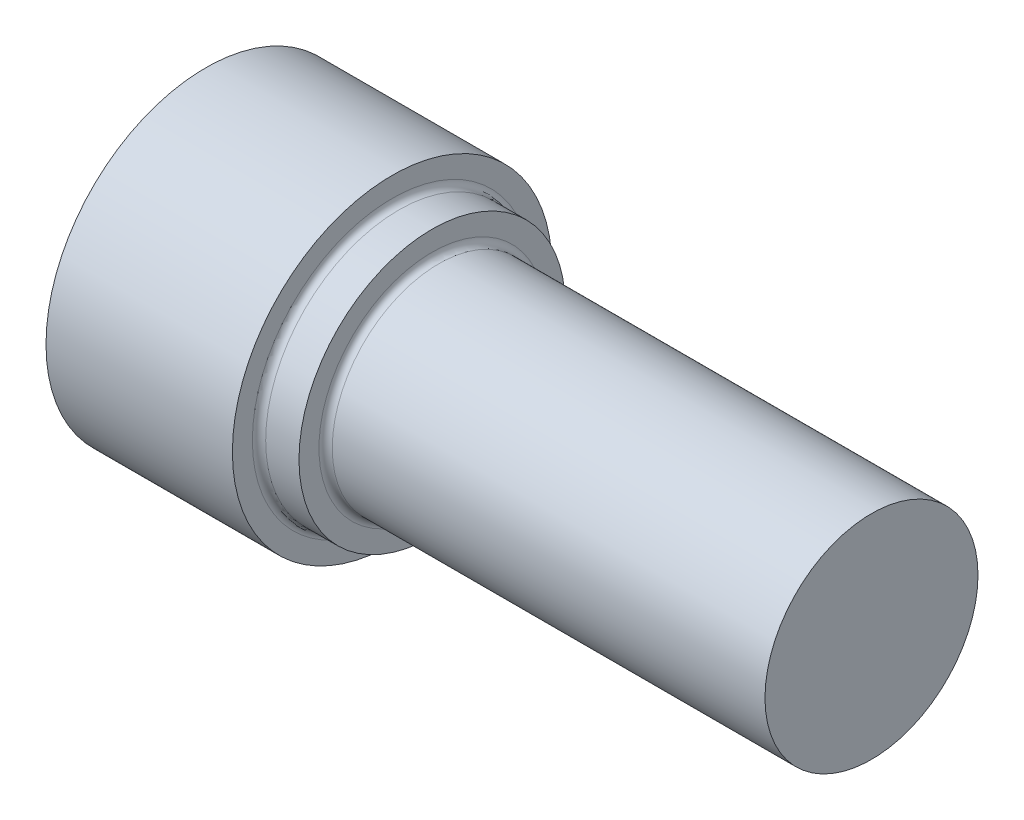
ISO-10303-21;
HEADER;
FILE_DESCRIPTION(('STEP AP214'),'2;1');
FILE_NAME('part.step','',(''),(''),'','','');
FILE_SCHEMA(('AUTOMOTIVE_DESIGN { 1 0 10303 214 1 1 1 1 }'));
ENDSEC;
DATA;
#1=APPLICATION_CONTEXT('core data for automotive mechanical design processes');
#2=APPLICATION_PROTOCOL_DEFINITION('international standard','automotive_design',2000,#1);
#3=PRODUCT_CONTEXT('',#1,'mechanical');
#4=PRODUCT('Part','Part','',(#3));
#5=PRODUCT_RELATED_PRODUCT_CATEGORY('part','',(#4));
#6=PRODUCT_DEFINITION_FORMATION('','',#4);
#7=PRODUCT_DEFINITION_CONTEXT('part definition',#1,'design');
#8=PRODUCT_DEFINITION('design','',#6,#7);
#9=PRODUCT_DEFINITION_SHAPE('','',#8);
#10=(LENGTH_UNIT() NAMED_UNIT(*) SI_UNIT(.MILLI.,.METRE.));
#11=(NAMED_UNIT(*) PLANE_ANGLE_UNIT() SI_UNIT($,.RADIAN.));
#12=(NAMED_UNIT(*) SI_UNIT($,.STERADIAN.) SOLID_ANGLE_UNIT());
#13=UNCERTAINTY_MEASURE_WITH_UNIT(LENGTH_MEASURE(1.E-05),#10,'distance_accuracy_value','');
#14=(GEOMETRIC_REPRESENTATION_CONTEXT(3) GLOBAL_UNCERTAINTY_ASSIGNED_CONTEXT((#13)) GLOBAL_UNIT_ASSIGNED_CONTEXT((#10,
#11,#12)) REPRESENTATION_CONTEXT('',''));
#15=CARTESIAN_POINT('',(0.,0.,0.));
#16=DIRECTION('',(0.,0.,1.));
#17=DIRECTION('',(1.,0.,0.));
#18=AXIS2_PLACEMENT_3D('',#15,#16,#17);
#19=CARTESIAN_POINT('',(17.,0.,0.));
#20=DIRECTION('',(1.,0.,0.));
#21=DIRECTION('',(0.,0.,-1.));
#22=AXIS2_PLACEMENT_3D('',#19,#20,#21);
#23=PLANE('',#22);
#24=CARTESIAN_POINT('',(17.,0.,0.));
#25=DIRECTION('',(1.,0.,0.));
#26=DIRECTION('',(0.,0.,-1.));
#27=AXIS2_PLACEMENT_3D('',#24,#25,#26);
#28=CIRCLE('',#27,8.5);
#29=CARTESIAN_POINT('',(17.,0.,-8.5));
#30=VERTEX_POINT('',#29);
#31=EDGE_CURVE('E10',#30,#30,#28,.F.);
#32=ORIENTED_EDGE('',*,*,#31,.T.);
#33=EDGE_LOOP('',(#32));
#34=FACE_BOUND('',#33,.T.);
#35=CARTESIAN_POINT('',(17.,0.,0.));
#36=DIRECTION('',(1.,0.,0.));
#37=DIRECTION('',(0.,0.,-1.));
#38=AXIS2_PLACEMENT_3D('',#35,#36,#37);
#39=CIRCLE('',#38,10.);
#40=CARTESIAN_POINT('',(17.,0.,-10.));
#41=VERTEX_POINT('',#40);
#42=EDGE_CURVE('E56',#41,#41,#39,.T.);
#43=ORIENTED_EDGE('',*,*,#42,.T.);
#44=EDGE_LOOP('',(#43));
#45=FACE_BOUND('',#44,.T.);
#46=ADVANCED_FACE('F32',(#34,#45),#23,.T.);
#47=CARTESIAN_POINT('',(14.,0.,0.));
#48=DIRECTION('',(1.,0.,0.));
#49=DIRECTION('',(0.,0.,-1.));
#50=AXIS2_PLACEMENT_3D('',#47,#48,#49);
#51=PLANE('',#50);
#52=CARTESIAN_POINT('',(14.,0.,0.));
#53=DIRECTION('',(1.,0.,0.));
#54=DIRECTION('',(0.,0.,-1.));
#55=AXIS2_PLACEMENT_3D('',#52,#53,#54);
#56=CIRCLE('',#55,10.5);
#57=CARTESIAN_POINT('',(14.,0.,-10.5));
#58=VERTEX_POINT('',#57);
#59=EDGE_CURVE('E43',#58,#58,#56,.F.);
#60=ORIENTED_EDGE('',*,*,#59,.T.);
#61=EDGE_LOOP('',(#60));
#62=FACE_BOUND('',#61,.T.);
#63=CARTESIAN_POINT('',(14.,0.,0.));
#64=DIRECTION('',(1.,0.,0.));
#65=DIRECTION('',(0.,0.,-1.));
#66=AXIS2_PLACEMENT_3D('',#63,#64,#65);
#67=CIRCLE('',#66,12.);
#68=CARTESIAN_POINT('',(14.,0.,-12.));
#69=VERTEX_POINT('',#68);
#70=EDGE_CURVE('E52',#69,#69,#67,.T.);
#71=ORIENTED_EDGE('',*,*,#70,.T.);
#72=EDGE_LOOP('',(#71));
#73=FACE_BOUND('',#72,.T.);
#74=ADVANCED_FACE('F82',(#62,#73),#51,.T.);
#75=CARTESIAN_POINT('',(14.,0.,0.));
#76=DIRECTION('',(-1.,0.,0.));
#77=DIRECTION('',(0.,0.,1.));
#78=AXIS2_PLACEMENT_3D('',#75,#76,#77);
#79=CYLINDRICAL_SURFACE('',#78,12.);
#80=ORIENTED_EDGE('',*,*,#70,.F.);
#81=EDGE_LOOP('',(#80));
#82=FACE_BOUND('',#81,.T.);
#83=CARTESIAN_POINT('',(0.,0.,0.));
#84=DIRECTION('',(1.,0.,0.));
#85=DIRECTION('',(0.,0.,-1.));
#86=AXIS2_PLACEMENT_3D('',#83,#84,#85);
#87=CIRCLE('',#86,12.);
#88=CARTESIAN_POINT('',(0.,0.,-12.));
#89=VERTEX_POINT('',#88);
#90=EDGE_CURVE('E53',#89,#89,#87,.T.);
#91=ORIENTED_EDGE('',*,*,#90,.T.);
#92=EDGE_LOOP('',(#91));
#93=FACE_BOUND('',#92,.T.);
#94=ADVANCED_FACE('F86',(#82,#93),#79,.T.);
#95=CARTESIAN_POINT('',(0.,0.,0.));
#96=DIRECTION('',(1.,0.,0.));
#97=DIRECTION('',(0.,0.,-1.));
#98=AXIS2_PLACEMENT_3D('',#95,#96,#97);
#99=PLANE('',#98);
#100=ORIENTED_EDGE('',*,*,#90,.F.);
#101=EDGE_LOOP('',(#100));
#102=FACE_BOUND('',#101,.T.);
#103=ADVANCED_FACE('F77',(#102),#99,.F.);
#104=CARTESIAN_POINT('',(17.,0.,0.));
#105=DIRECTION('',(-1.,0.,0.));
#106=DIRECTION('',(0.,0.,1.));
#107=AXIS2_PLACEMENT_3D('',#104,#105,#106);
#108=CYLINDRICAL_SURFACE('',#107,10.);
#109=CARTESIAN_POINT('',(14.5,0.,0.));
#110=DIRECTION('',(1.,0.,0.));
#111=DIRECTION('',(0.,0.,-1.));
#112=AXIS2_PLACEMENT_3D('',#109,#110,#111);
#113=CIRCLE('',#112,10.);
#114=CARTESIAN_POINT('',(14.5,0.,-10.));
#115=VERTEX_POINT('',#114);
#116=EDGE_CURVE('E47',#115,#115,#113,.T.);
#117=ORIENTED_EDGE('',*,*,#116,.T.);
#118=EDGE_LOOP('',(#117));
#119=FACE_BOUND('',#118,.T.);
#120=ORIENTED_EDGE('',*,*,#42,.F.);
#121=EDGE_LOOP('',(#120));
#122=FACE_BOUND('',#121,.T.);
#123=ADVANCED_FACE('F69',(#119,#122),#108,.T.);
#124=CARTESIAN_POINT('',(50.,0.,0.));
#125=DIRECTION('',(-1.,0.,0.));
#126=DIRECTION('',(0.,0.,1.));
#127=AXIS2_PLACEMENT_3D('',#124,#125,#126);
#128=CYLINDRICAL_SURFACE('',#127,8.);
#129=CARTESIAN_POINT('',(17.5,0.,0.));
#130=DIRECTION('',(1.,0.,0.));
#131=DIRECTION('',(0.,0.,-1.));
#132=AXIS2_PLACEMENT_3D('',#129,#130,#131);
#133=CIRCLE('',#132,8.);
#134=CARTESIAN_POINT('',(17.5,0.,-8.));
#135=VERTEX_POINT('',#134);
#136=EDGE_CURVE('E39',#135,#135,#133,.T.);
#137=ORIENTED_EDGE('',*,*,#136,.T.);
#138=EDGE_LOOP('',(#137));
#139=FACE_BOUND('',#138,.T.);
#140=CARTESIAN_POINT('',(50.,0.,0.));
#141=DIRECTION('',(1.,0.,0.));
#142=DIRECTION('',(0.,0.,-1.));
#143=AXIS2_PLACEMENT_3D('',#140,#141,#142);
#144=CIRCLE('',#143,8.);
#145=CARTESIAN_POINT('',(50.,0.,-8.));
#146=VERTEX_POINT('',#145);
#147=EDGE_CURVE('E61',#146,#146,#144,.T.);
#148=ORIENTED_EDGE('',*,*,#147,.F.);
#149=EDGE_LOOP('',(#148));
#150=FACE_BOUND('',#149,.T.);
#151=ADVANCED_FACE('F67',(#139,#150),#128,.T.);
#152=CARTESIAN_POINT('',(50.,0.,0.));
#153=DIRECTION('',(1.,0.,0.));
#154=DIRECTION('',(0.,0.,-1.));
#155=AXIS2_PLACEMENT_3D('',#152,#153,#154);
#156=PLANE('',#155);
#157=ORIENTED_EDGE('',*,*,#147,.T.);
#158=EDGE_LOOP('',(#157));
#159=FACE_BOUND('',#158,.T.);
#160=ADVANCED_FACE('F65',(#159),#156,.T.);
#161=CARTESIAN_POINT('',(14.5,0.,0.));
#162=DIRECTION('',(1.,0.,0.));
#163=DIRECTION('',(0.,0.,-1.));
#164=AXIS2_PLACEMENT_3D('',#161,#162,#163);
#165=TOROIDAL_SURFACE('',#164,10.5,0.5);
#166=ORIENTED_EDGE('',*,*,#59,.F.);
#167=EDGE_LOOP('',(#166));
#168=FACE_BOUND('',#167,.T.);
#169=ORIENTED_EDGE('',*,*,#116,.F.);
#170=EDGE_LOOP('',(#169));
#171=FACE_BOUND('',#170,.T.);
#172=ADVANCED_FACE('F75',(#168,#171),#165,.F.);
#173=CARTESIAN_POINT('',(17.5,0.,0.));
#174=DIRECTION('',(1.,0.,0.));
#175=DIRECTION('',(0.,0.,-1.));
#176=AXIS2_PLACEMENT_3D('',#173,#174,#175);
#177=TOROIDAL_SURFACE('',#176,8.5,0.5);
#178=ORIENTED_EDGE('',*,*,#31,.F.);
#179=EDGE_LOOP('',(#178));
#180=FACE_BOUND('',#179,.T.);
#181=ORIENTED_EDGE('',*,*,#136,.F.);
#182=EDGE_LOOP('',(#181));
#183=FACE_BOUND('',#182,.T.);
#184=ADVANCED_FACE('F34',(#180,#183),#177,.F.);
#185=CLOSED_SHELL('',(#46,#74,#94,#103,#123,#151,#160,#172,#184));
#186=MANIFOLD_SOLID_BREP('B2',#185);
#187=ADVANCED_BREP_SHAPE_REPRESENTATION('',(#18,#186),#14);
#188=SHAPE_DEFINITION_REPRESENTATION(#9,#187);
ENDSEC;
END-ISO-10303-21;
